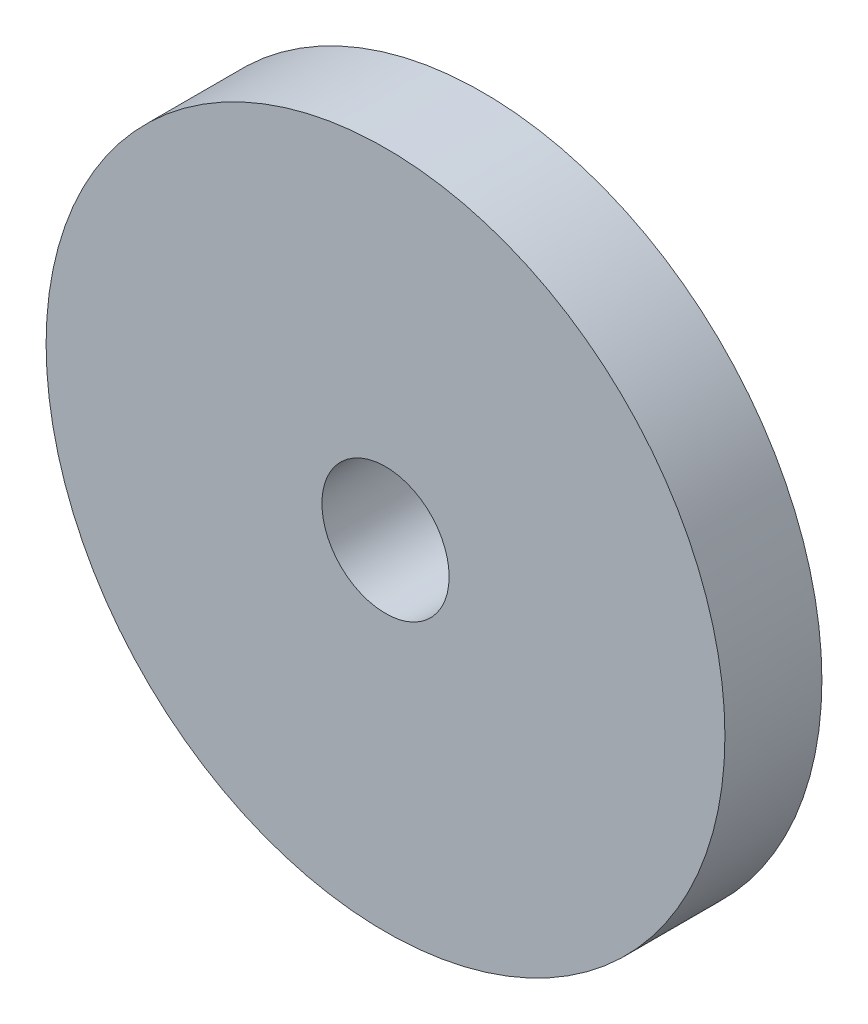
ISO-10303-21;
HEADER;
FILE_DESCRIPTION(('STEP AP214'),'2;1');
FILE_NAME('part.step','',(''),(''),'','','');
FILE_SCHEMA(('AUTOMOTIVE_DESIGN { 1 0 10303 214 1 1 1 1 }'));
ENDSEC;
DATA;
#1=APPLICATION_CONTEXT('core data for automotive mechanical design processes');
#2=APPLICATION_PROTOCOL_DEFINITION('international standard','automotive_design',2000,#1);
#3=PRODUCT_CONTEXT('',#1,'mechanical');
#4=PRODUCT('Part','Part','',(#3));
#5=PRODUCT_RELATED_PRODUCT_CATEGORY('part','',(#4));
#6=PRODUCT_DEFINITION_FORMATION('','',#4);
#7=PRODUCT_DEFINITION_CONTEXT('part definition',#1,'design');
#8=PRODUCT_DEFINITION('design','',#6,#7);
#9=PRODUCT_DEFINITION_SHAPE('','',#8);
#10=(LENGTH_UNIT() NAMED_UNIT(*) SI_UNIT(.MILLI.,.METRE.));
#11=(NAMED_UNIT(*) PLANE_ANGLE_UNIT() SI_UNIT($,.RADIAN.));
#12=(NAMED_UNIT(*) SI_UNIT($,.STERADIAN.) SOLID_ANGLE_UNIT());
#13=UNCERTAINTY_MEASURE_WITH_UNIT(LENGTH_MEASURE(1.E-05),#10,'distance_accuracy_value','');
#14=(GEOMETRIC_REPRESENTATION_CONTEXT(3) GLOBAL_UNCERTAINTY_ASSIGNED_CONTEXT((#13)) GLOBAL_UNIT_ASSIGNED_CONTEXT((#10,
#11,#12)) REPRESENTATION_CONTEXT('',''));
#15=CARTESIAN_POINT('',(0.,0.,0.));
#16=DIRECTION('',(0.,0.,1.));
#17=DIRECTION('',(1.,0.,0.));
#18=AXIS2_PLACEMENT_3D('',#15,#16,#17);
#19=CARTESIAN_POINT('',(0.,0.,3.175));
#20=DIRECTION('',(0.,0.,-1.));
#21=DIRECTION('',(-1.,0.,0.));
#22=AXIS2_PLACEMENT_3D('',#19,#20,#21);
#23=CYLINDRICAL_SURFACE('',#22,11.1125);
#24=CARTESIAN_POINT('',(0.,0.,3.175));
#25=DIRECTION('',(0.,0.,1.));
#26=DIRECTION('',(1.,0.,0.));
#27=AXIS2_PLACEMENT_3D('',#24,#25,#26);
#28=CIRCLE('',#27,11.1125);
#29=CARTESIAN_POINT('',(11.1125,0.,3.175));
#30=VERTEX_POINT('',#29);
#31=EDGE_CURVE('E10',#30,#30,#28,.T.);
#32=ORIENTED_EDGE('',*,*,#31,.F.);
#33=EDGE_LOOP('',(#32));
#34=FACE_BOUND('',#33,.T.);
#35=CARTESIAN_POINT('',(0.,0.,0.));
#36=DIRECTION('',(0.,0.,1.));
#37=DIRECTION('',(1.,0.,0.));
#38=AXIS2_PLACEMENT_3D('',#35,#36,#37);
#39=CIRCLE('',#38,11.1125);
#40=CARTESIAN_POINT('',(11.1125,0.,0.));
#41=VERTEX_POINT('',#40);
#42=EDGE_CURVE('E35',#41,#41,#39,.T.);
#43=ORIENTED_EDGE('',*,*,#42,.T.);
#44=EDGE_LOOP('',(#43));
#45=FACE_BOUND('',#44,.T.);
#46=ADVANCED_FACE('F32',(#34,#45),#23,.T.);
#47=CARTESIAN_POINT('',(0.,0.,3.175));
#48=DIRECTION('',(0.,0.,1.));
#49=DIRECTION('',(1.,0.,0.));
#50=AXIS2_PLACEMENT_3D('',#47,#48,#49);
#51=PLANE('',#50);
#52=CARTESIAN_POINT('',(0.,0.,3.175));
#53=DIRECTION('',(0.,0.,1.));
#54=DIRECTION('',(1.,0.,0.));
#55=AXIS2_PLACEMENT_3D('',#52,#53,#54);
#56=CIRCLE('',#55,2.0828);
#57=CARTESIAN_POINT('',(2.0828,0.,3.175));
#58=VERTEX_POINT('',#57);
#59=EDGE_CURVE('E44',#58,#58,#56,.T.);
#60=ORIENTED_EDGE('',*,*,#59,.F.);
#61=EDGE_LOOP('',(#60));
#62=FACE_BOUND('',#61,.T.);
#63=ORIENTED_EDGE('',*,*,#31,.T.);
#64=EDGE_LOOP('',(#63));
#65=FACE_BOUND('',#64,.T.);
#66=ADVANCED_FACE('F59',(#62,#65),#51,.T.);
#67=CARTESIAN_POINT('',(0.,0.,0.));
#68=DIRECTION('',(0.,0.,1.));
#69=DIRECTION('',(1.,0.,0.));
#70=AXIS2_PLACEMENT_3D('',#67,#68,#69);
#71=PLANE('',#70);
#72=CARTESIAN_POINT('',(0.,0.,0.));
#73=DIRECTION('',(0.,0.,1.));
#74=DIRECTION('',(1.,0.,0.));
#75=AXIS2_PLACEMENT_3D('',#72,#73,#74);
#76=CIRCLE('',#75,2.0828);
#77=CARTESIAN_POINT('',(2.0828,0.,0.));
#78=VERTEX_POINT('',#77);
#79=EDGE_CURVE('E42',#78,#78,#76,.T.);
#80=ORIENTED_EDGE('',*,*,#79,.T.);
#81=EDGE_LOOP('',(#80));
#82=FACE_BOUND('',#81,.T.);
#83=ORIENTED_EDGE('',*,*,#42,.F.);
#84=EDGE_LOOP('',(#83));
#85=FACE_BOUND('',#84,.T.);
#86=ADVANCED_FACE('F50',(#82,#85),#71,.F.);
#87=CARTESIAN_POINT('',(0.,0.,0.));
#88=DIRECTION('',(0.,0.,1.));
#89=DIRECTION('',(1.,0.,0.));
#90=AXIS2_PLACEMENT_3D('',#87,#88,#89);
#91=CYLINDRICAL_SURFACE('',#90,2.0828);
#92=ORIENTED_EDGE('',*,*,#79,.F.);
#93=EDGE_LOOP('',(#92));
#94=FACE_BOUND('',#93,.T.);
#95=ORIENTED_EDGE('',*,*,#59,.T.);
#96=EDGE_LOOP('',(#95));
#97=FACE_BOUND('',#96,.T.);
#98=ADVANCED_FACE('F53',(#94,#97),#91,.F.);
#99=CLOSED_SHELL('',(#46,#66,#86,#98));
#100=MANIFOLD_SOLID_BREP('B2',#99);
#101=ADVANCED_BREP_SHAPE_REPRESENTATION('',(#18,#100),#14);
#102=SHAPE_DEFINITION_REPRESENTATION(#9,#101);
ENDSEC;
END-ISO-10303-21;
